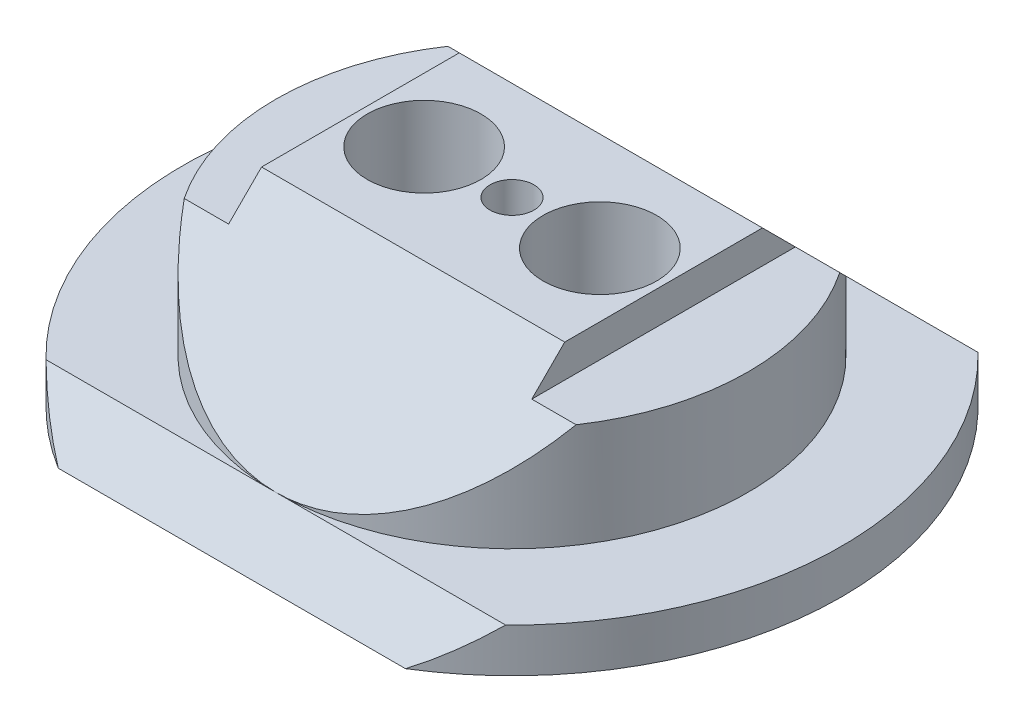
ISO-10303-21;
HEADER;
FILE_DESCRIPTION(('STEP AP214'),'2;1');
FILE_NAME('part.step','',(''),(''),'','','');
FILE_SCHEMA(('AUTOMOTIVE_DESIGN { 1 0 10303 214 1 1 1 1 }'));
ENDSEC;
DATA;
#1=APPLICATION_CONTEXT('core data for automotive mechanical design processes');
#2=APPLICATION_PROTOCOL_DEFINITION('international standard','automotive_design',2000,#1);
#3=PRODUCT_CONTEXT('',#1,'mechanical');
#4=PRODUCT('Part','Part','',(#3));
#5=PRODUCT_RELATED_PRODUCT_CATEGORY('part','',(#4));
#6=PRODUCT_DEFINITION_FORMATION('','',#4);
#7=PRODUCT_DEFINITION_CONTEXT('part definition',#1,'design');
#8=PRODUCT_DEFINITION('design','',#6,#7);
#9=PRODUCT_DEFINITION_SHAPE('','',#8);
#10=(LENGTH_UNIT() NAMED_UNIT(*) SI_UNIT(.MILLI.,.METRE.));
#11=(NAMED_UNIT(*) PLANE_ANGLE_UNIT() SI_UNIT($,.RADIAN.));
#12=(NAMED_UNIT(*) SI_UNIT($,.STERADIAN.) SOLID_ANGLE_UNIT());
#13=UNCERTAINTY_MEASURE_WITH_UNIT(LENGTH_MEASURE(1.E-05),#10,'distance_accuracy_value','');
#14=(GEOMETRIC_REPRESENTATION_CONTEXT(3) GLOBAL_UNCERTAINTY_ASSIGNED_CONTEXT((#13)) GLOBAL_UNIT_ASSIGNED_CONTEXT((#10,
#11,#12)) REPRESENTATION_CONTEXT('',''));
#15=CARTESIAN_POINT('',(0.,0.,0.));
#16=DIRECTION('',(0.,0.,1.));
#17=DIRECTION('',(1.,0.,0.));
#18=AXIS2_PLACEMENT_3D('',#15,#16,#17);
#19=CARTESIAN_POINT('',(0.,20.,0.));
#20=DIRECTION('',(0.,-1.,0.));
#21=DIRECTION('',(0.,0.,-1.));
#22=AXIS2_PLACEMENT_3D('',#19,#20,#21);
#23=CYLINDRICAL_SURFACE('',#22,1.375);
#24=CARTESIAN_POINT('',(0.,0.,0.));
#25=DIRECTION('',(0.,-1.,0.));
#26=DIRECTION('',(0.,0.,-1.));
#27=AXIS2_PLACEMENT_3D('',#24,#25,#26);
#28=CIRCLE('',#27,1.375);
#29=CARTESIAN_POINT('',(0.,0.,-1.375));
#30=VERTEX_POINT('',#29);
#31=EDGE_CURVE('E159',#30,#30,#28,.T.);
#32=ORIENTED_EDGE('',*,*,#31,.T.);
#33=EDGE_LOOP('',(#32));
#34=FACE_BOUND('',#33,.T.);
#35=CARTESIAN_POINT('',(0.,10.5,0.));
#36=DIRECTION('',(0.,1.,0.));
#37=DIRECTION('',(0.,0.,1.));
#38=AXIS2_PLACEMENT_3D('',#35,#36,#37);
#39=CIRCLE('',#38,1.375);
#40=CARTESIAN_POINT('',(0.,10.5,1.375));
#41=VERTEX_POINT('',#40);
#42=EDGE_CURVE('E63',#41,#41,#39,.F.);
#43=ORIENTED_EDGE('',*,*,#42,.F.);
#44=EDGE_LOOP('',(#43));
#45=FACE_BOUND('',#44,.T.);
#46=ADVANCED_FACE('F59',(#34,#45),#23,.F.);
#47=CARTESIAN_POINT('',(0.,0.,0.));
#48=DIRECTION('',(0.,1.,0.));
#49=DIRECTION('',(0.,0.,1.));
#50=AXIS2_PLACEMENT_3D('',#47,#48,#49);
#51=PLANE('',#50);
#52=CARTESIAN_POINT('',(-14.,0.,12.));
#53=DIRECTION('',(0.,-1.,0.));
#54=DIRECTION('',(0.,0.,-1.));
#55=AXIS2_PLACEMENT_3D('',#52,#53,#54);
#56=CIRCLE('',#55,5.);
#57=CARTESIAN_POINT('',(-14.,0.,7.));
#58=VERTEX_POINT('',#57);
#59=EDGE_CURVE('E628',#58,#58,#56,.T.);
#60=ORIENTED_EDGE('',*,*,#59,.F.);
#61=EDGE_LOOP('',(#60));
#62=FACE_BOUND('',#61,.T.);
#63=CARTESIAN_POINT('',(22.,0.,0.));
#64=DIRECTION('',(0.,-1.,0.));
#65=DIRECTION('',(0.,0.,-1.));
#66=AXIS2_PLACEMENT_3D('',#63,#64,#65);
#67=CIRCLE('',#66,5.);
#68=CARTESIAN_POINT('',(22.,0.,-5.));
#69=VERTEX_POINT('',#68);
#70=EDGE_CURVE('E627',#69,#69,#67,.T.);
#71=ORIENTED_EDGE('',*,*,#70,.F.);
#72=EDGE_LOOP('',(#71));
#73=FACE_BOUND('',#72,.T.);
#74=CARTESIAN_POINT('',(-22.,0.,0.));
#75=DIRECTION('',(0.,-1.,0.));
#76=DIRECTION('',(0.,0.,-1.));
#77=AXIS2_PLACEMENT_3D('',#74,#75,#76);
#78=CIRCLE('',#77,5.);
#79=CARTESIAN_POINT('',(-22.,0.,-5.));
#80=VERTEX_POINT('',#79);
#81=EDGE_CURVE('E653',#80,#80,#78,.T.);
#82=ORIENTED_EDGE('',*,*,#81,.F.);
#83=EDGE_LOOP('',(#82));
#84=FACE_BOUND('',#83,.T.);
#85=CARTESIAN_POINT('',(0.,0.,15.));
#86=DIRECTION('',(0.,-1.,0.));
#87=DIRECTION('',(0.,0.,-1.));
#88=AXIS2_PLACEMENT_3D('',#85,#86,#87);
#89=CIRCLE('',#88,5.);
#90=CARTESIAN_POINT('',(0.,0.,10.));
#91=VERTEX_POINT('',#90);
#92=EDGE_CURVE('E645',#91,#91,#89,.T.);
#93=ORIENTED_EDGE('',*,*,#92,.F.);
#94=EDGE_LOOP('',(#93));
#95=FACE_BOUND('',#94,.T.);
#96=CARTESIAN_POINT('',(14.,0.,-12.));
#97=DIRECTION('',(0.,-1.,0.));
#98=DIRECTION('',(0.,0.,-1.));
#99=AXIS2_PLACEMENT_3D('',#96,#97,#98);
#100=CIRCLE('',#99,5.);
#101=CARTESIAN_POINT('',(14.,0.,-17.));
#102=VERTEX_POINT('',#101);
#103=EDGE_CURVE('E700',#102,#102,#100,.T.);
#104=ORIENTED_EDGE('',*,*,#103,.F.);
#105=EDGE_LOOP('',(#104));
#106=FACE_BOUND('',#105,.T.);
#107=CARTESIAN_POINT('',(-14.,0.,-12.));
#108=DIRECTION('',(0.,-1.,0.));
#109=DIRECTION('',(0.,0.,-1.));
#110=AXIS2_PLACEMENT_3D('',#107,#108,#109);
#111=CIRCLE('',#110,5.);
#112=CARTESIAN_POINT('',(-14.,0.,-17.));
#113=VERTEX_POINT('',#112);
#114=EDGE_CURVE('E684',#113,#113,#111,.T.);
#115=ORIENTED_EDGE('',*,*,#114,.F.);
#116=EDGE_LOOP('',(#115));
#117=FACE_BOUND('',#116,.T.);
#118=CARTESIAN_POINT('',(14.,0.,12.));
#119=DIRECTION('',(0.,-1.,0.));
#120=DIRECTION('',(0.,0.,-1.));
#121=AXIS2_PLACEMENT_3D('',#118,#119,#120);
#122=CIRCLE('',#121,5.);
#123=CARTESIAN_POINT('',(14.,0.,7.));
#124=VERTEX_POINT('',#123);
#125=EDGE_CURVE('E693',#124,#124,#122,.T.);
#126=ORIENTED_EDGE('',*,*,#125,.F.);
#127=EDGE_LOOP('',(#126));
#128=FACE_BOUND('',#127,.T.);
#129=CARTESIAN_POINT('',(0.,0.,-15.));
#130=DIRECTION('',(0.,-1.,0.));
#131=DIRECTION('',(0.,0.,-1.));
#132=AXIS2_PLACEMENT_3D('',#129,#130,#131);
#133=CIRCLE('',#132,5.);
#134=CARTESIAN_POINT('',(0.,0.,-20.));
#135=VERTEX_POINT('',#134);
#136=EDGE_CURVE('E644',#135,#135,#133,.T.);
#137=ORIENTED_EDGE('',*,*,#136,.F.);
#138=EDGE_LOOP('',(#137));
#139=FACE_BOUND('',#138,.T.);
#140=ORIENTED_EDGE('',*,*,#31,.F.);
#141=EDGE_LOOP('',(#140));
#142=FACE_BOUND('',#141,.T.);
#143=CARTESIAN_POINT('',(-8.,0.,0.));
#144=DIRECTION('',(0.,1.,0.));
#145=DIRECTION('',(0.,0.,1.));
#146=AXIS2_PLACEMENT_3D('',#143,#144,#145);
#147=CIRCLE('',#146,5.175);
#148=CARTESIAN_POINT('',(-8.,0.,5.175));
#149=VERTEX_POINT('',#148);
#150=EDGE_CURVE('E199',#149,#149,#147,.T.);
#151=ORIENTED_EDGE('',*,*,#150,.T.);
#152=EDGE_LOOP('',(#151));
#153=FACE_BOUND('',#152,.T.);
#154=CARTESIAN_POINT('',(8.,0.,0.));
#155=DIRECTION('',(0.,1.,0.));
#156=DIRECTION('',(0.,0.,1.));
#157=AXIS2_PLACEMENT_3D('',#154,#155,#156);
#158=CIRCLE('',#157,5.175);
#159=CARTESIAN_POINT('',(8.,0.,5.175));
#160=VERTEX_POINT('',#159);
#161=EDGE_CURVE('E192',#160,#160,#158,.T.);
#162=ORIENTED_EDGE('',*,*,#161,.T.);
#163=EDGE_LOOP('',(#162));
#164=FACE_BOUND('',#163,.T.);
#165=DIRECTION('',(1.,0.,0.));
#166=VECTOR('',#165,1.);
#167=CARTESIAN_POINT('',(0.,0.,25.5));
#168=LINE('',#167,#166);
#169=CARTESIAN_POINT('',(-15.8034806292791,0.,25.5));
#170=VERTEX_POINT('',#169);
#171=CARTESIAN_POINT('',(15.8034806292791,0.,25.5));
#172=VERTEX_POINT('',#171);
#173=EDGE_CURVE('E222',#170,#172,#168,.T.);
#174=ORIENTED_EDGE('',*,*,#173,.F.);
#175=CARTESIAN_POINT('',(0.,0.,0.));
#176=DIRECTION('',(0.,1.,0.));
#177=DIRECTION('',(0.,0.,1.));
#178=AXIS2_PLACEMENT_3D('',#175,#176,#177);
#179=CIRCLE('',#178,30.);
#180=CARTESIAN_POINT('',(-15.8034806292789,0.,-25.5000000000001));
#181=VERTEX_POINT('',#180);
#182=EDGE_CURVE('E252',#181,#170,#179,.T.);
#183=ORIENTED_EDGE('',*,*,#182,.F.);
#184=DIRECTION('',(-1.,0.,0.));
#185=VECTOR('',#184,1.);
#186=CARTESIAN_POINT('',(0.,0.,-25.5000000000001));
#187=LINE('',#186,#185);
#188=CARTESIAN_POINT('',(15.8034806292789,0.,-25.5000000000001));
#189=VERTEX_POINT('',#188);
#190=EDGE_CURVE('E226',#189,#181,#187,.T.);
#191=ORIENTED_EDGE('',*,*,#190,.F.);
#192=EDGE_CURVE('E241',#172,#189,#179,.T.);
#193=ORIENTED_EDGE('',*,*,#192,.F.);
#194=EDGE_LOOP('',(#174,#183,#191,#193));
#195=FACE_BOUND('',#194,.T.);
#196=ADVANCED_FACE('F309',(#62,#73,#84,#95,#106,#117,#128,#139,#142,#153,#164,#195),#51,.F.);
#197=CARTESIAN_POINT('',(0.,4.,0.));
#198=DIRECTION('',(0.,-1.,0.));
#199=DIRECTION('',(0.,0.,-1.));
#200=AXIS2_PLACEMENT_3D('',#197,#198,#199);
#201=CYLINDRICAL_SURFACE('',#200,30.);
#202=CARTESIAN_POINT('',(0.,4.,0.));
#203=DIRECTION('',(0.,1.,0.));
#204=DIRECTION('',(0.,0.,1.));
#205=AXIS2_PLACEMENT_3D('',#202,#203,#204);
#206=CIRCLE('',#205,30.);
#207=CARTESIAN_POINT('',(20.9224759529077,4.,21.5));
#208=VERTEX_POINT('',#207);
#209=CARTESIAN_POINT('',(20.9224759529077,4.,-21.5));
#210=VERTEX_POINT('',#209);
#211=EDGE_CURVE('E215',#208,#210,#206,.T.);
#212=ORIENTED_EDGE('',*,*,#211,.F.);
#213=CARTESIAN_POINT('',(0.,25.4999999999998,0.));
#214=DIRECTION('',(0.,-0.707106781186551,-0.707106781186544));
#215=DIRECTION('',(0.,-0.707106781186544,0.707106781186551));
#216=AXIS2_PLACEMENT_3D('',#213,#214,#215);
#217=ELLIPSE('',#216,42.4264068711926,30.);
#218=EDGE_CURVE('E242',#172,#208,#217,.F.);
#219=ORIENTED_EDGE('',*,*,#218,.F.);
#220=ORIENTED_EDGE('',*,*,#192,.T.);
#221=CARTESIAN_POINT('',(0.,25.4999999999995,0.));
#222=DIRECTION('',(0.,-0.707106781186556,0.707106781186539));
#223=DIRECTION('',(0.,-0.707106781186539,-0.707106781186556));
#224=AXIS2_PLACEMENT_3D('',#221,#222,#223);
#225=ELLIPSE('',#224,42.4264068711924,30.);
#226=EDGE_CURVE('E238',#210,#189,#225,.F.);
#227=ORIENTED_EDGE('',*,*,#226,.F.);
#228=EDGE_LOOP('',(#212,#219,#220,#227));
#229=FACE_BOUND('',#228,.T.);
#230=ADVANCED_FACE('F61',(#229),#201,.T.);
#231=CARTESIAN_POINT('',(0.,4.,0.));
#232=DIRECTION('',(0.,1.,0.));
#233=DIRECTION('',(0.,0.,1.));
#234=AXIS2_PLACEMENT_3D('',#231,#232,#233);
#235=CIRCLE('',#234,30.);
#236=CARTESIAN_POINT('',(-20.9224759529077,4.,-21.5));
#237=VERTEX_POINT('',#236);
#238=CARTESIAN_POINT('',(-20.9224759529077,4.,21.5));
#239=VERTEX_POINT('',#238);
#240=EDGE_CURVE('E212',#237,#239,#235,.T.);
#241=ORIENTED_EDGE('',*,*,#240,.F.);
#242=CARTESIAN_POINT('',(0.,25.4999999999995,0.));
#243=DIRECTION('',(0.,0.707106781186556,-0.707106781186539));
#244=DIRECTION('',(0.,-0.707106781186539,-0.707106781186556));
#245=AXIS2_PLACEMENT_3D('',#242,#243,#244);
#246=ELLIPSE('',#245,42.4264068711924,30.);
#247=EDGE_CURVE('E230',#237,#181,#246,.F.);
#248=ORIENTED_EDGE('',*,*,#247,.T.);
#249=ORIENTED_EDGE('',*,*,#182,.T.);
#250=CARTESIAN_POINT('',(0.,25.4999999999998,0.));
#251=DIRECTION('',(0.,0.707106781186551,0.707106781186544));
#252=DIRECTION('',(0.,-0.707106781186544,0.707106781186551));
#253=AXIS2_PLACEMENT_3D('',#250,#251,#252);
#254=ELLIPSE('',#253,42.4264068711926,30.);
#255=EDGE_CURVE('E233',#170,#239,#254,.F.);
#256=ORIENTED_EDGE('',*,*,#255,.T.);
#257=EDGE_LOOP('',(#241,#248,#249,#256));
#258=FACE_BOUND('',#257,.T.);
#259=ADVANCED_FACE('F318',(#258),#201,.T.);
#260=CARTESIAN_POINT('',(30.001,16.5,8.99999999999987));
#261=DIRECTION('',(0.,-0.707106781186551,-0.707106781186544));
#262=DIRECTION('',(0.,0.707106781186544,-0.707106781186551));
#263=AXIS2_PLACEMENT_3D('',#260,#261,#262);
#264=PLANE('',#263);
#265=DIRECTION('',(1.,0.,0.));
#266=VECTOR('',#265,1.);
#267=CARTESIAN_POINT('',(30.001,4.,21.5));
#268=LINE('',#267,#266);
#269=CARTESIAN_POINT('',(0.,3.99999999999999,21.5));
#270=VERTEX_POINT('',#269);
#271=EDGE_CURVE('E221',#239,#270,#268,.T.);
#272=ORIENTED_EDGE('',*,*,#271,.F.);
#273=ORIENTED_EDGE('',*,*,#255,.F.);
#274=ORIENTED_EDGE('',*,*,#173,.T.);
#275=ORIENTED_EDGE('',*,*,#218,.T.);
#276=EDGE_CURVE('E218',#270,#208,#268,.T.);
#277=ORIENTED_EDGE('',*,*,#276,.F.);
#278=EDGE_LOOP('',(#272,#273,#274,#275,#277));
#279=FACE_BOUND('',#278,.T.);
#280=ADVANCED_FACE('F301',(#279),#264,.F.);
#281=CARTESIAN_POINT('',(30.001,16.5,-8.99999999999971));
#282=DIRECTION('',(0.,-0.707106781186556,0.707106781186539));
#283=DIRECTION('',(0.,-0.707106781186539,-0.707106781186556));
#284=AXIS2_PLACEMENT_3D('',#281,#282,#283);
#285=PLANE('',#284);
#286=DIRECTION('',(-1.,0.,0.));
#287=VECTOR('',#286,1.);
#288=CARTESIAN_POINT('',(30.001,4.,-21.5));
#289=LINE('',#288,#287);
#290=CARTESIAN_POINT('',(0.,4.,-21.5));
#291=VERTEX_POINT('',#290);
#292=EDGE_CURVE('E262',#210,#291,#289,.T.);
#293=ORIENTED_EDGE('',*,*,#292,.F.);
#294=ORIENTED_EDGE('',*,*,#226,.T.);
#295=ORIENTED_EDGE('',*,*,#190,.T.);
#296=ORIENTED_EDGE('',*,*,#247,.F.);
#297=EDGE_CURVE('E259',#291,#237,#289,.T.);
#298=ORIENTED_EDGE('',*,*,#297,.F.);
#299=EDGE_LOOP('',(#293,#294,#295,#296,#298));
#300=FACE_BOUND('',#299,.T.);
#301=ADVANCED_FACE('F316',(#300),#285,.F.);
#302=CARTESIAN_POINT('',(0.,96.0338927753446,0.));
#303=DIRECTION('',(0.,-1.,0.));
#304=DIRECTION('',(0.,0.,-1.));
#305=AXIS2_PLACEMENT_3D('',#302,#303,#304);
#306=CYLINDRICAL_SURFACE('',#305,21.5);
#307=CARTESIAN_POINT('',(0.,13.5,0.));
#308=DIRECTION('',(0.,-1.,0.));
#309=DIRECTION('',(1.,0.,0.));
#310=AXIS2_PLACEMENT_3D('',#307,#308,#309);
#311=CIRCLE('',#310,21.5);
#312=CARTESIAN_POINT('',(17.8395627749114,13.5,-11.9999999999998));
#313=VERTEX_POINT('',#312);
#314=CARTESIAN_POINT('',(17.8395627749114,13.5,11.9999999999999));
#315=VERTEX_POINT('',#314);
#316=EDGE_CURVE('E180',#313,#315,#311,.T.);
#317=ORIENTED_EDGE('',*,*,#316,.T.);
#318=CARTESIAN_POINT('',(0.,25.4999999999998,0.));
#319=DIRECTION('',(0.,-0.707106781186551,-0.707106781186544));
#320=DIRECTION('',(0.,-0.707106781186544,0.707106781186551));
#321=AXIS2_PLACEMENT_3D('',#318,#319,#320);
#322=ELLIPSE('',#321,30.4055915910214,21.5);
#323=EDGE_CURVE('E211',#270,#315,#322,.F.);
#324=ORIENTED_EDGE('',*,*,#323,.F.);
#325=CARTESIAN_POINT('',(0.,4.,0.));
#326=DIRECTION('',(0.,1.,0.));
#327=DIRECTION('',(0.,0.,1.));
#328=AXIS2_PLACEMENT_3D('',#325,#326,#327);
#329=CIRCLE('',#328,21.5);
#330=EDGE_CURVE('E204',#270,#291,#329,.T.);
#331=ORIENTED_EDGE('',*,*,#330,.T.);
#332=CARTESIAN_POINT('',(0.,25.4999999999995,0.));
#333=DIRECTION('',(0.,-0.707106781186556,0.707106781186539));
#334=DIRECTION('',(0.,-0.707106781186539,-0.707106781186556));
#335=AXIS2_PLACEMENT_3D('',#332,#333,#334);
#336=ELLIPSE('',#335,30.4055915910212,21.5);
#337=EDGE_CURVE('E256',#313,#291,#336,.F.);
#338=ORIENTED_EDGE('',*,*,#337,.F.);
#339=EDGE_LOOP('',(#317,#324,#331,#338));
#340=FACE_BOUND('',#339,.T.);
#341=ADVANCED_FACE('F292',(#340),#306,.T.);
#342=CARTESIAN_POINT('',(0.,4.,0.));
#343=DIRECTION('',(0.,1.,0.));
#344=DIRECTION('',(0.,0.,1.));
#345=AXIS2_PLACEMENT_3D('',#342,#343,#344);
#346=PLANE('',#345);
#347=ORIENTED_EDGE('',*,*,#276,.T.);
#348=ORIENTED_EDGE('',*,*,#211,.T.);
#349=ORIENTED_EDGE('',*,*,#292,.T.);
#350=ORIENTED_EDGE('',*,*,#330,.F.);
#351=EDGE_LOOP('',(#347,#348,#349,#350));
#352=FACE_BOUND('',#351,.T.);
#353=ADVANCED_FACE('F298',(#352),#346,.T.);
#354=ORIENTED_EDGE('',*,*,#271,.T.);
#355=EDGE_CURVE('E203',#291,#270,#329,.T.);
#356=ORIENTED_EDGE('',*,*,#355,.F.);
#357=ORIENTED_EDGE('',*,*,#297,.T.);
#358=ORIENTED_EDGE('',*,*,#240,.T.);
#359=EDGE_LOOP('',(#354,#356,#357,#358));
#360=FACE_BOUND('',#359,.T.);
#361=ADVANCED_FACE('F285',(#360),#346,.T.);
#362=CARTESIAN_POINT('',(-17.8395627749113,13.5,11.9999999999999));
#363=VERTEX_POINT('',#362);
#364=EDGE_CURVE('E208',#363,#270,#322,.F.);
#365=ORIENTED_EDGE('',*,*,#364,.F.);
#366=CARTESIAN_POINT('',(0.,13.5,0.));
#367=DIRECTION('',(0.,-1.,0.));
#368=DIRECTION('',(0.,0.,-1.));
#369=AXIS2_PLACEMENT_3D('',#366,#367,#368);
#370=CIRCLE('',#369,21.5);
#371=CARTESIAN_POINT('',(-17.8395627749114,13.5,-11.9999999999998));
#372=VERTEX_POINT('',#371);
#373=EDGE_CURVE('E76',#363,#372,#370,.T.);
#374=ORIENTED_EDGE('',*,*,#373,.T.);
#375=EDGE_CURVE('E164',#291,#372,#336,.F.);
#376=ORIENTED_EDGE('',*,*,#375,.F.);
#377=ORIENTED_EDGE('',*,*,#355,.T.);
#378=EDGE_LOOP('',(#365,#374,#376,#377));
#379=FACE_BOUND('',#378,.T.);
#380=ADVANCED_FACE('F277',(#379),#306,.T.);
#381=DIRECTION('',(1.,0.,0.));
#382=VECTOR('',#381,1.);
#383=CARTESIAN_POINT('',(30.001,13.5,-11.9999999999998));
#384=LINE('',#383,#382);
#385=CARTESIAN_POINT('',(-13.8,13.5,-11.9999999999998));
#386=VERTEX_POINT('',#385);
#387=EDGE_CURVE('E155',#372,#386,#384,.T.);
#388=ORIENTED_EDGE('',*,*,#387,.T.);
#389=DIRECTION('',(0.,0.707106781186539,0.707106781186556));
#390=VECTOR('',#389,1.);
#391=CARTESIAN_POINT('',(-13.8,16.5,-8.99999999999971));
#392=LINE('',#391,#390);
#393=CARTESIAN_POINT('',(-13.8,16.5,-8.99999999999971));
#394=VERTEX_POINT('',#393);
#395=EDGE_CURVE('E144',#386,#394,#392,.T.);
#396=ORIENTED_EDGE('',*,*,#395,.T.);
#397=DIRECTION('',(-1.,0.,0.));
#398=VECTOR('',#397,1.);
#399=CARTESIAN_POINT('',(30.001,16.5,-8.99999999999971));
#400=LINE('',#399,#398);
#401=CARTESIAN_POINT('',(13.8,16.5,-8.99999999999971));
#402=VERTEX_POINT('',#401);
#403=EDGE_CURVE('E246',#402,#394,#400,.T.);
#404=ORIENTED_EDGE('',*,*,#403,.F.);
#405=DIRECTION('',(0.,-0.707106781186539,-0.707106781186556));
#406=VECTOR('',#405,1.);
#407=CARTESIAN_POINT('',(13.8,16.5,-8.99999999999971));
#408=LINE('',#407,#406);
#409=CARTESIAN_POINT('',(13.8,13.5,-11.9999999999998));
#410=VERTEX_POINT('',#409);
#411=EDGE_CURVE('E174',#402,#410,#408,.T.);
#412=ORIENTED_EDGE('',*,*,#411,.T.);
#413=DIRECTION('',(1.,0.,0.));
#414=VECTOR('',#413,1.);
#415=CARTESIAN_POINT('',(30.001,13.5,-11.9999999999998));
#416=LINE('',#415,#414);
#417=EDGE_CURVE('E183',#410,#313,#416,.T.);
#418=ORIENTED_EDGE('',*,*,#417,.T.);
#419=ORIENTED_EDGE('',*,*,#337,.T.);
#420=ORIENTED_EDGE('',*,*,#375,.T.);
#421=EDGE_LOOP('',(#388,#396,#404,#412,#418,#419,#420));
#422=FACE_BOUND('',#421,.T.);
#423=ADVANCED_FACE('F162',(#422),#285,.F.);
#424=CARTESIAN_POINT('',(30.001,16.5,8.99999999999987));
#425=DIRECTION('',(0.,-1.,0.));
#426=DIRECTION('',(0.,0.,-1.));
#427=AXIS2_PLACEMENT_3D('',#424,#425,#426);
#428=PLANE('',#427);
#429=CARTESIAN_POINT('',(0.,16.5,0.));
#430=DIRECTION('',(0.,1.,0.));
#431=DIRECTION('',(0.,0.,1.));
#432=AXIS2_PLACEMENT_3D('',#429,#430,#431);
#433=CIRCLE('',#432,2.);
#434=CARTESIAN_POINT('',(0.,16.5,2.00000000000001));
#435=VERTEX_POINT('',#434);
#436=EDGE_CURVE('E661',#435,#435,#433,.T.);
#437=ORIENTED_EDGE('',*,*,#436,.F.);
#438=EDGE_LOOP('',(#437));
#439=FACE_BOUND('',#438,.T.);
#440=CARTESIAN_POINT('',(-8.,16.5,0.));
#441=DIRECTION('',(0.,1.,0.));
#442=DIRECTION('',(0.,0.,1.));
#443=AXIS2_PLACEMENT_3D('',#440,#441,#442);
#444=CIRCLE('',#443,5.175);
#445=CARTESIAN_POINT('',(-8.,16.5,5.17500000000001));
#446=VERTEX_POINT('',#445);
#447=EDGE_CURVE('E188',#446,#446,#444,.T.);
#448=ORIENTED_EDGE('',*,*,#447,.F.);
#449=EDGE_LOOP('',(#448));
#450=FACE_BOUND('',#449,.T.);
#451=CARTESIAN_POINT('',(8.,16.5,0.));
#452=DIRECTION('',(0.,1.,0.));
#453=DIRECTION('',(0.,0.,1.));
#454=AXIS2_PLACEMENT_3D('',#451,#452,#453);
#455=CIRCLE('',#454,5.175);
#456=CARTESIAN_POINT('',(8.,16.5,5.17500000000001));
#457=VERTEX_POINT('',#456);
#458=EDGE_CURVE('E187',#457,#457,#455,.T.);
#459=ORIENTED_EDGE('',*,*,#458,.F.);
#460=EDGE_LOOP('',(#459));
#461=FACE_BOUND('',#460,.T.);
#462=ORIENTED_EDGE('',*,*,#403,.T.);
#463=DIRECTION('',(0.,0.,1.));
#464=VECTOR('',#463,1.);
#465=CARTESIAN_POINT('',(-13.8,16.5,-25.5000000000001));
#466=LINE('',#465,#464);
#467=CARTESIAN_POINT('',(-13.8,16.5,8.99999999999986));
#468=VERTEX_POINT('',#467);
#469=EDGE_CURVE('E149',#394,#468,#466,.T.);
#470=ORIENTED_EDGE('',*,*,#469,.T.);
#471=DIRECTION('',(-1.,0.,0.));
#472=VECTOR('',#471,1.);
#473=CARTESIAN_POINT('',(30.001,16.5,8.99999999999987));
#474=LINE('',#473,#472);
#475=CARTESIAN_POINT('',(13.8,16.5,8.99999999999987));
#476=VERTEX_POINT('',#475);
#477=EDGE_CURVE('E237',#476,#468,#474,.T.);
#478=ORIENTED_EDGE('',*,*,#477,.F.);
#479=DIRECTION('',(0.,0.,1.));
#480=VECTOR('',#479,1.);
#481=CARTESIAN_POINT('',(13.8,16.5,-25.5000000000001));
#482=LINE('',#481,#480);
#483=EDGE_CURVE('E84',#402,#476,#482,.T.);
#484=ORIENTED_EDGE('',*,*,#483,.F.);
#485=EDGE_LOOP('',(#462,#470,#478,#484));
#486=FACE_BOUND('',#485,.T.);
#487=ADVANCED_FACE('F363',(#439,#450,#461,#486),#428,.F.);
#488=ORIENTED_EDGE('',*,*,#477,.T.);
#489=DIRECTION('',(0.,-0.707106781186544,0.707106781186551));
#490=VECTOR('',#489,1.);
#491=CARTESIAN_POINT('',(-13.8,16.5,8.99999999999987));
#492=LINE('',#491,#490);
#493=CARTESIAN_POINT('',(-13.8,13.5,11.9999999999999));
#494=VERTEX_POINT('',#493);
#495=EDGE_CURVE('E13',#468,#494,#492,.T.);
#496=ORIENTED_EDGE('',*,*,#495,.T.);
#497=DIRECTION('',(-1.,0.,0.));
#498=VECTOR('',#497,1.);
#499=CARTESIAN_POINT('',(30.001,13.5,11.9999999999999));
#500=LINE('',#499,#498);
#501=EDGE_CURVE('E69',#494,#363,#500,.T.);
#502=ORIENTED_EDGE('',*,*,#501,.T.);
#503=ORIENTED_EDGE('',*,*,#364,.T.);
#504=ORIENTED_EDGE('',*,*,#323,.T.);
#505=DIRECTION('',(-1.,0.,0.));
#506=VECTOR('',#505,1.);
#507=CARTESIAN_POINT('',(30.001,13.5,11.9999999999999));
#508=LINE('',#507,#506);
#509=CARTESIAN_POINT('',(13.8,13.5,11.9999999999999));
#510=VERTEX_POINT('',#509);
#511=EDGE_CURVE('E266',#315,#510,#508,.T.);
#512=ORIENTED_EDGE('',*,*,#511,.T.);
#513=DIRECTION('',(0.,0.707106781186544,-0.707106781186551));
#514=VECTOR('',#513,1.);
#515=CARTESIAN_POINT('',(13.8,16.5,8.99999999999987));
#516=LINE('',#515,#514);
#517=EDGE_CURVE('E263',#510,#476,#516,.T.);
#518=ORIENTED_EDGE('',*,*,#517,.T.);
#519=EDGE_LOOP('',(#488,#496,#502,#503,#504,#512,#518));
#520=FACE_BOUND('',#519,.T.);
#521=ADVANCED_FACE('F273',(#520),#264,.F.);
#522=CARTESIAN_POINT('',(8.,-7.50000000000001,0.));
#523=DIRECTION('',(0.,1.,0.));
#524=DIRECTION('',(0.,0.,1.));
#525=AXIS2_PLACEMENT_3D('',#522,#523,#524);
#526=CYLINDRICAL_SURFACE('',#525,5.175);
#527=ORIENTED_EDGE('',*,*,#458,.T.);
#528=EDGE_LOOP('',(#527));
#529=FACE_BOUND('',#528,.T.);
#530=ORIENTED_EDGE('',*,*,#161,.F.);
#531=EDGE_LOOP('',(#530));
#532=FACE_BOUND('',#531,.T.);
#533=ADVANCED_FACE('F353',(#529,#532),#526,.F.);
#534=CARTESIAN_POINT('',(-8.,-7.50000000000001,0.));
#535=DIRECTION('',(0.,1.,0.));
#536=DIRECTION('',(0.,0.,1.));
#537=AXIS2_PLACEMENT_3D('',#534,#535,#536);
#538=CYLINDRICAL_SURFACE('',#537,5.175);
#539=ORIENTED_EDGE('',*,*,#447,.T.);
#540=EDGE_LOOP('',(#539));
#541=FACE_BOUND('',#540,.T.);
#542=ORIENTED_EDGE('',*,*,#150,.F.);
#543=EDGE_LOOP('',(#542));
#544=FACE_BOUND('',#543,.T.);
#545=ADVANCED_FACE('F347',(#541,#544),#538,.F.);
#546=CARTESIAN_POINT('',(21.5,13.5,-25.5000000000001));
#547=DIRECTION('',(0.,-1.,0.));
#548=DIRECTION('',(1.,0.,0.));
#549=AXIS2_PLACEMENT_3D('',#546,#547,#548);
#550=PLANE('',#549);
#551=DIRECTION('',(0.,0.,1.));
#552=VECTOR('',#551,1.);
#553=CARTESIAN_POINT('',(13.8,13.5,-25.5000000000001));
#554=LINE('',#553,#552);
#555=EDGE_CURVE('E170',#410,#510,#554,.T.);
#556=ORIENTED_EDGE('',*,*,#555,.T.);
#557=ORIENTED_EDGE('',*,*,#511,.F.);
#558=ORIENTED_EDGE('',*,*,#316,.F.);
#559=ORIENTED_EDGE('',*,*,#417,.F.);
#560=EDGE_LOOP('',(#556,#557,#558,#559));
#561=FACE_BOUND('',#560,.T.);
#562=ADVANCED_FACE('F344',(#561),#550,.F.);
#563=CARTESIAN_POINT('',(13.8,13.5,-25.5000000000001));
#564=DIRECTION('',(-1.,0.,0.));
#565=DIRECTION('',(0.,0.,1.));
#566=AXIS2_PLACEMENT_3D('',#563,#564,#565);
#567=PLANE('',#566);
#568=ORIENTED_EDGE('',*,*,#483,.T.);
#569=ORIENTED_EDGE('',*,*,#517,.F.);
#570=ORIENTED_EDGE('',*,*,#555,.F.);
#571=ORIENTED_EDGE('',*,*,#411,.F.);
#572=EDGE_LOOP('',(#568,#569,#570,#571));
#573=FACE_BOUND('',#572,.T.);
#574=ADVANCED_FACE('F340',(#573),#567,.F.);
#575=CARTESIAN_POINT('',(-13.8,13.5,-25.5000000000001));
#576=DIRECTION('',(1.,0.,0.));
#577=DIRECTION('',(0.,0.,-1.));
#578=AXIS2_PLACEMENT_3D('',#575,#576,#577);
#579=PLANE('',#578);
#580=DIRECTION('',(0.,0.,1.));
#581=VECTOR('',#580,1.);
#582=CARTESIAN_POINT('',(-13.8,13.5,-25.5000000000001));
#583=LINE('',#582,#581);
#584=EDGE_CURVE('E147',#386,#494,#583,.T.);
#585=ORIENTED_EDGE('',*,*,#584,.T.);
#586=ORIENTED_EDGE('',*,*,#495,.F.);
#587=ORIENTED_EDGE('',*,*,#469,.F.);
#588=ORIENTED_EDGE('',*,*,#395,.F.);
#589=EDGE_LOOP('',(#585,#586,#587,#588));
#590=FACE_BOUND('',#589,.T.);
#591=ADVANCED_FACE('F146',(#590),#579,.F.);
#592=CARTESIAN_POINT('',(-21.5,13.5,-25.5000000000001));
#593=DIRECTION('',(0.,-1.,0.));
#594=DIRECTION('',(0.,0.,-1.));
#595=AXIS2_PLACEMENT_3D('',#592,#593,#594);
#596=PLANE('',#595);
#597=ORIENTED_EDGE('',*,*,#373,.F.);
#598=ORIENTED_EDGE('',*,*,#501,.F.);
#599=ORIENTED_EDGE('',*,*,#584,.F.);
#600=ORIENTED_EDGE('',*,*,#387,.F.);
#601=EDGE_LOOP('',(#597,#598,#599,#600));
#602=FACE_BOUND('',#601,.T.);
#603=ADVANCED_FACE('F157',(#602),#596,.F.);
#604=CARTESIAN_POINT('',(0.,10.5,0.));
#605=DIRECTION('',(0.,1.,0.));
#606=DIRECTION('',(0.,0.,1.));
#607=AXIS2_PLACEMENT_3D('',#604,#605,#606);
#608=PLANE('',#607);
#609=CARTESIAN_POINT('',(0.,10.5,0.));
#610=DIRECTION('',(0.,1.,0.));
#611=DIRECTION('',(0.,0.,1.));
#612=AXIS2_PLACEMENT_3D('',#609,#610,#611);
#613=CIRCLE('',#612,2.);
#614=CARTESIAN_POINT('',(0.,10.5,2.));
#615=VERTEX_POINT('',#614);
#616=EDGE_CURVE('E665',#615,#615,#613,.T.);
#617=ORIENTED_EDGE('',*,*,#616,.T.);
#618=EDGE_LOOP('',(#617));
#619=FACE_BOUND('',#618,.T.);
#620=ORIENTED_EDGE('',*,*,#42,.T.);
#621=EDGE_LOOP('',(#620));
#622=FACE_BOUND('',#621,.T.);
#623=ADVANCED_FACE('F343',(#619,#622),#608,.T.);
#624=CARTESIAN_POINT('',(0.,10.5,0.));
#625=DIRECTION('',(0.,1.,0.));
#626=DIRECTION('',(0.,0.,1.));
#627=AXIS2_PLACEMENT_3D('',#624,#625,#626);
#628=CYLINDRICAL_SURFACE('',#627,2.);
#629=ORIENTED_EDGE('',*,*,#616,.F.);
#630=EDGE_LOOP('',(#629));
#631=FACE_BOUND('',#630,.T.);
#632=ORIENTED_EDGE('',*,*,#436,.T.);
#633=EDGE_LOOP('',(#632));
#634=FACE_BOUND('',#633,.T.);
#635=ADVANCED_FACE('F336',(#631,#634),#628,.F.);
#636=CARTESIAN_POINT('',(0.,3.,-15.));
#637=DIRECTION('',(0.,-1.,0.));
#638=DIRECTION('',(0.,0.,-1.));
#639=AXIS2_PLACEMENT_3D('',#636,#637,#638);
#640=CYLINDRICAL_SURFACE('',#639,5.);
#641=CARTESIAN_POINT('',(0.,3.,-15.));
#642=DIRECTION('',(0.,-1.,0.));
#643=DIRECTION('',(0.,0.,-1.));
#644=AXIS2_PLACEMENT_3D('',#641,#642,#643);
#645=CIRCLE('',#644,5.);
#646=CARTESIAN_POINT('',(0.,3.,-20.));
#647=VERTEX_POINT('',#646);
#648=EDGE_CURVE('E657',#647,#647,#645,.T.);
#649=ORIENTED_EDGE('',*,*,#648,.F.);
#650=EDGE_LOOP('',(#649));
#651=FACE_BOUND('',#650,.T.);
#652=ORIENTED_EDGE('',*,*,#136,.T.);
#653=EDGE_LOOP('',(#652));
#654=FACE_BOUND('',#653,.T.);
#655=ADVANCED_FACE('F453',(#651,#654),#640,.F.);
#656=CARTESIAN_POINT('',(0.,3.,-15.));
#657=DIRECTION('',(0.,-1.,0.));
#658=DIRECTION('',(0.,0.,-1.));
#659=AXIS2_PLACEMENT_3D('',#656,#657,#658);
#660=PLANE('',#659);
#661=ORIENTED_EDGE('',*,*,#648,.T.);
#662=EDGE_LOOP('',(#661));
#663=FACE_BOUND('',#662,.T.);
#664=ADVANCED_FACE('F469',(#663),#660,.T.);
#665=CARTESIAN_POINT('',(14.,3.,12.));
#666=DIRECTION('',(0.,-1.,0.));
#667=DIRECTION('',(0.,0.,-1.));
#668=AXIS2_PLACEMENT_3D('',#665,#666,#667);
#669=CYLINDRICAL_SURFACE('',#668,5.);
#670=CARTESIAN_POINT('',(14.,3.,12.));
#671=DIRECTION('',(0.,-1.,0.));
#672=DIRECTION('',(0.,0.,-1.));
#673=AXIS2_PLACEMENT_3D('',#670,#671,#672);
#674=CIRCLE('',#673,5.);
#675=CARTESIAN_POINT('',(14.,3.,7.));
#676=VERTEX_POINT('',#675);
#677=EDGE_CURVE('E636',#676,#676,#674,.T.);
#678=ORIENTED_EDGE('',*,*,#677,.F.);
#679=EDGE_LOOP('',(#678));
#680=FACE_BOUND('',#679,.T.);
#681=ORIENTED_EDGE('',*,*,#125,.T.);
#682=EDGE_LOOP('',(#681));
#683=FACE_BOUND('',#682,.T.);
#684=ADVANCED_FACE('F479',(#680,#683),#669,.F.);
#685=CARTESIAN_POINT('',(14.,3.,12.));
#686=DIRECTION('',(0.,-1.,0.));
#687=DIRECTION('',(0.,0.,-1.));
#688=AXIS2_PLACEMENT_3D('',#685,#686,#687);
#689=PLANE('',#688);
#690=ORIENTED_EDGE('',*,*,#677,.T.);
#691=EDGE_LOOP('',(#690));
#692=FACE_BOUND('',#691,.T.);
#693=ADVANCED_FACE('F489',(#692),#689,.T.);
#694=CARTESIAN_POINT('',(-14.,3.,-12.));
#695=DIRECTION('',(0.,-1.,0.));
#696=DIRECTION('',(0.,0.,-1.));
#697=AXIS2_PLACEMENT_3D('',#694,#695,#696);
#698=CYLINDRICAL_SURFACE('',#697,5.);
#699=CARTESIAN_POINT('',(-14.,3.,-12.));
#700=DIRECTION('',(0.,-1.,0.));
#701=DIRECTION('',(0.,0.,-1.));
#702=AXIS2_PLACEMENT_3D('',#699,#700,#701);
#703=CIRCLE('',#702,5.);
#704=CARTESIAN_POINT('',(-14.,3.,-17.));
#705=VERTEX_POINT('',#704);
#706=EDGE_CURVE('E688',#705,#705,#703,.T.);
#707=ORIENTED_EDGE('',*,*,#706,.F.);
#708=EDGE_LOOP('',(#707));
#709=FACE_BOUND('',#708,.T.);
#710=ORIENTED_EDGE('',*,*,#114,.T.);
#711=EDGE_LOOP('',(#710));
#712=FACE_BOUND('',#711,.T.);
#713=ADVANCED_FACE('F499',(#709,#712),#698,.F.);
#714=CARTESIAN_POINT('',(-14.,3.,-12.));
#715=DIRECTION('',(0.,-1.,0.));
#716=DIRECTION('',(0.,0.,-1.));
#717=AXIS2_PLACEMENT_3D('',#714,#715,#716);
#718=PLANE('',#717);
#719=ORIENTED_EDGE('',*,*,#706,.T.);
#720=EDGE_LOOP('',(#719));
#721=FACE_BOUND('',#720,.T.);
#722=ADVANCED_FACE('F509',(#721),#718,.T.);
#723=CARTESIAN_POINT('',(14.,3.,-12.));
#724=DIRECTION('',(0.,-1.,0.));
#725=DIRECTION('',(0.,0.,-1.));
#726=AXIS2_PLACEMENT_3D('',#723,#724,#725);
#727=CYLINDRICAL_SURFACE('',#726,5.);
#728=CARTESIAN_POINT('',(14.,3.,-12.));
#729=DIRECTION('',(0.,-1.,0.));
#730=DIRECTION('',(0.,0.,-1.));
#731=AXIS2_PLACEMENT_3D('',#728,#729,#730);
#732=CIRCLE('',#731,5.);
#733=CARTESIAN_POINT('',(14.,3.,-17.));
#734=VERTEX_POINT('',#733);
#735=EDGE_CURVE('E689',#734,#734,#732,.T.);
#736=ORIENTED_EDGE('',*,*,#735,.F.);
#737=EDGE_LOOP('',(#736));
#738=FACE_BOUND('',#737,.T.);
#739=ORIENTED_EDGE('',*,*,#103,.T.);
#740=EDGE_LOOP('',(#739));
#741=FACE_BOUND('',#740,.T.);
#742=ADVANCED_FACE('F519',(#738,#741),#727,.F.);
#743=CARTESIAN_POINT('',(14.,3.,-12.));
#744=DIRECTION('',(0.,-1.,0.));
#745=DIRECTION('',(0.,0.,-1.));
#746=AXIS2_PLACEMENT_3D('',#743,#744,#745);
#747=PLANE('',#746);
#748=ORIENTED_EDGE('',*,*,#735,.T.);
#749=EDGE_LOOP('',(#748));
#750=FACE_BOUND('',#749,.T.);
#751=ADVANCED_FACE('F529',(#750),#747,.T.);
#752=CARTESIAN_POINT('',(0.,3.,15.));
#753=DIRECTION('',(0.,-1.,0.));
#754=DIRECTION('',(0.,0.,-1.));
#755=AXIS2_PLACEMENT_3D('',#752,#753,#754);
#756=CYLINDRICAL_SURFACE('',#755,5.);
#757=CARTESIAN_POINT('',(0.,3.,15.));
#758=DIRECTION('',(0.,-1.,0.));
#759=DIRECTION('',(0.,0.,-1.));
#760=AXIS2_PLACEMENT_3D('',#757,#758,#759);
#761=CIRCLE('',#760,5.);
#762=CARTESIAN_POINT('',(0.,3.,10.));
#763=VERTEX_POINT('',#762);
#764=EDGE_CURVE('E640',#763,#763,#761,.T.);
#765=ORIENTED_EDGE('',*,*,#764,.F.);
#766=EDGE_LOOP('',(#765));
#767=FACE_BOUND('',#766,.T.);
#768=ORIENTED_EDGE('',*,*,#92,.T.);
#769=EDGE_LOOP('',(#768));
#770=FACE_BOUND('',#769,.T.);
#771=ADVANCED_FACE('F539',(#767,#770),#756,.F.);
#772=CARTESIAN_POINT('',(0.,3.,15.));
#773=DIRECTION('',(0.,-1.,0.));
#774=DIRECTION('',(0.,0.,-1.));
#775=AXIS2_PLACEMENT_3D('',#772,#773,#774);
#776=PLANE('',#775);
#777=ORIENTED_EDGE('',*,*,#764,.T.);
#778=EDGE_LOOP('',(#777));
#779=FACE_BOUND('',#778,.T.);
#780=ADVANCED_FACE('F549',(#779),#776,.T.);
#781=CARTESIAN_POINT('',(-22.,3.,0.));
#782=DIRECTION('',(0.,-1.,0.));
#783=DIRECTION('',(0.,0.,-1.));
#784=AXIS2_PLACEMENT_3D('',#781,#782,#783);
#785=CYLINDRICAL_SURFACE('',#784,5.);
#786=CARTESIAN_POINT('',(-22.,3.,0.));
#787=DIRECTION('',(0.,-1.,0.));
#788=DIRECTION('',(0.,0.,-1.));
#789=AXIS2_PLACEMENT_3D('',#786,#787,#788);
#790=CIRCLE('',#789,5.);
#791=CARTESIAN_POINT('',(-22.,3.,-5.));
#792=VERTEX_POINT('',#791);
#793=EDGE_CURVE('E649',#792,#792,#790,.T.);
#794=ORIENTED_EDGE('',*,*,#793,.F.);
#795=EDGE_LOOP('',(#794));
#796=FACE_BOUND('',#795,.T.);
#797=ORIENTED_EDGE('',*,*,#81,.T.);
#798=EDGE_LOOP('',(#797));
#799=FACE_BOUND('',#798,.T.);
#800=ADVANCED_FACE('F559',(#796,#799),#785,.F.);
#801=CARTESIAN_POINT('',(-22.,3.,0.));
#802=DIRECTION('',(0.,-1.,0.));
#803=DIRECTION('',(0.,0.,-1.));
#804=AXIS2_PLACEMENT_3D('',#801,#802,#803);
#805=PLANE('',#804);
#806=ORIENTED_EDGE('',*,*,#793,.T.);
#807=EDGE_LOOP('',(#806));
#808=FACE_BOUND('',#807,.T.);
#809=ADVANCED_FACE('F569',(#808),#805,.T.);
#810=CARTESIAN_POINT('',(22.,3.,0.));
#811=DIRECTION('',(0.,-1.,0.));
#812=DIRECTION('',(0.,0.,-1.));
#813=AXIS2_PLACEMENT_3D('',#810,#811,#812);
#814=CYLINDRICAL_SURFACE('',#813,5.);
#815=CARTESIAN_POINT('',(22.,3.,0.));
#816=DIRECTION('',(0.,-1.,0.));
#817=DIRECTION('',(0.,0.,-1.));
#818=AXIS2_PLACEMENT_3D('',#815,#816,#817);
#819=CIRCLE('',#818,5.);
#820=CARTESIAN_POINT('',(22.,3.,-5.));
#821=VERTEX_POINT('',#820);
#822=EDGE_CURVE('E633',#821,#821,#819,.T.);
#823=ORIENTED_EDGE('',*,*,#822,.F.);
#824=EDGE_LOOP('',(#823));
#825=FACE_BOUND('',#824,.T.);
#826=ORIENTED_EDGE('',*,*,#70,.T.);
#827=EDGE_LOOP('',(#826));
#828=FACE_BOUND('',#827,.T.);
#829=ADVANCED_FACE('F579',(#825,#828),#814,.F.);
#830=CARTESIAN_POINT('',(22.,3.,0.));
#831=DIRECTION('',(0.,-1.,0.));
#832=DIRECTION('',(0.,0.,-1.));
#833=AXIS2_PLACEMENT_3D('',#830,#831,#832);
#834=PLANE('',#833);
#835=ORIENTED_EDGE('',*,*,#822,.T.);
#836=EDGE_LOOP('',(#835));
#837=FACE_BOUND('',#836,.T.);
#838=ADVANCED_FACE('F589',(#837),#834,.T.);
#839=CARTESIAN_POINT('',(-14.,3.,12.));
#840=DIRECTION('',(0.,-1.,0.));
#841=DIRECTION('',(0.,0.,-1.));
#842=AXIS2_PLACEMENT_3D('',#839,#840,#841);
#843=CYLINDRICAL_SURFACE('',#842,5.);
#844=CARTESIAN_POINT('',(-14.,3.,12.));
#845=DIRECTION('',(0.,-1.,0.));
#846=DIRECTION('',(0.,0.,-1.));
#847=AXIS2_PLACEMENT_3D('',#844,#845,#846);
#848=CIRCLE('',#847,5.);
#849=CARTESIAN_POINT('',(-14.,3.,7.));
#850=VERTEX_POINT('',#849);
#851=EDGE_CURVE('E625',#850,#850,#848,.T.);
#852=ORIENTED_EDGE('',*,*,#851,.F.);
#853=EDGE_LOOP('',(#852));
#854=FACE_BOUND('',#853,.T.);
#855=ORIENTED_EDGE('',*,*,#59,.T.);
#856=EDGE_LOOP('',(#855));
#857=FACE_BOUND('',#856,.T.);
#858=ADVANCED_FACE('F599',(#854,#857),#843,.F.);
#859=CARTESIAN_POINT('',(-14.,3.,12.));
#860=DIRECTION('',(0.,-1.,0.));
#861=DIRECTION('',(0.,0.,-1.));
#862=AXIS2_PLACEMENT_3D('',#859,#860,#861);
#863=PLANE('',#862);
#864=ORIENTED_EDGE('',*,*,#851,.T.);
#865=EDGE_LOOP('',(#864));
#866=FACE_BOUND('',#865,.T.);
#867=ADVANCED_FACE('F609',(#866),#863,.T.);
#868=CLOSED_SHELL('',(#46,#196,#230,#259,#280,#301,#341,#353,#361,#380,#423,#487,#521,#533,#545,
#562,#574,#591,#603,#623,#635,#655,#664,#684,#693,#713,#722,#742,#751,#771,#780,#800,#809,#829,
#838,#858,#867));
#869=MANIFOLD_SOLID_BREP('B2',#868);
#870=ADVANCED_BREP_SHAPE_REPRESENTATION('',(#18,#869),#14);
#871=SHAPE_DEFINITION_REPRESENTATION(#9,#870);
ENDSEC;
END-ISO-10303-21;
